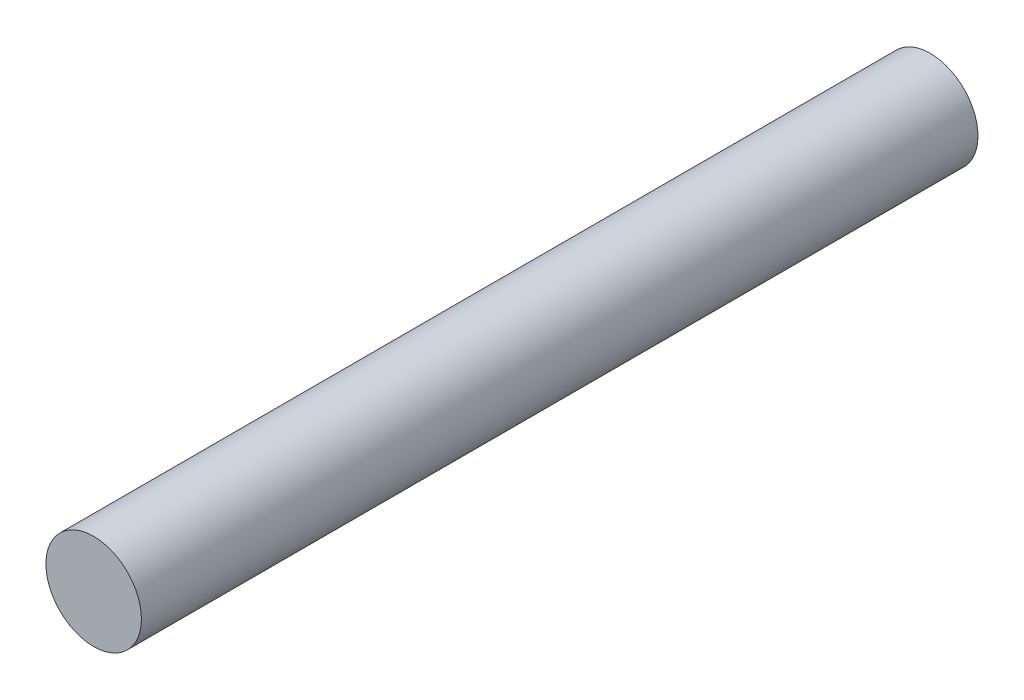
ISO-10303-21;
HEADER;
FILE_DESCRIPTION(('STEP AP214'),'2;1');
FILE_NAME('part.step','',(''),(''),'','','');
FILE_SCHEMA(('AUTOMOTIVE_DESIGN { 1 0 10303 214 1 1 1 1 }'));
ENDSEC;
DATA;
#1=APPLICATION_CONTEXT('core data for automotive mechanical design processes');
#2=APPLICATION_PROTOCOL_DEFINITION('international standard','automotive_design',2000,#1);
#3=PRODUCT_CONTEXT('',#1,'mechanical');
#4=PRODUCT('Part','Part','',(#3));
#5=PRODUCT_RELATED_PRODUCT_CATEGORY('part','',(#4));
#6=PRODUCT_DEFINITION_FORMATION('','',#4);
#7=PRODUCT_DEFINITION_CONTEXT('part definition',#1,'design');
#8=PRODUCT_DEFINITION('design','',#6,#7);
#9=PRODUCT_DEFINITION_SHAPE('','',#8);
#10=(LENGTH_UNIT() NAMED_UNIT(*) SI_UNIT(.MILLI.,.METRE.));
#11=(NAMED_UNIT(*) PLANE_ANGLE_UNIT() SI_UNIT($,.RADIAN.));
#12=(NAMED_UNIT(*) SI_UNIT($,.STERADIAN.) SOLID_ANGLE_UNIT());
#13=UNCERTAINTY_MEASURE_WITH_UNIT(LENGTH_MEASURE(1.E-05),#10,'distance_accuracy_value','');
#14=(GEOMETRIC_REPRESENTATION_CONTEXT(3) GLOBAL_UNCERTAINTY_ASSIGNED_CONTEXT((#13)) GLOBAL_UNIT_ASSIGNED_CONTEXT((#10,
#11,#12)) REPRESENTATION_CONTEXT('',''));
#15=CARTESIAN_POINT('',(0.,0.,0.));
#16=DIRECTION('',(0.,0.,1.));
#17=DIRECTION('',(1.,0.,0.));
#18=AXIS2_PLACEMENT_3D('',#15,#16,#17);
#19=CARTESIAN_POINT('',(0.,0.,-43.8));
#20=DIRECTION('',(0.,0.,1.));
#21=DIRECTION('',(-1.,0.,0.));
#22=AXIS2_PLACEMENT_3D('',#19,#20,#21);
#23=CYLINDRICAL_SURFACE('',#22,2.5);
#24=CARTESIAN_POINT('',(0.,0.,-43.8));
#25=DIRECTION('',(0.,0.,1.));
#26=DIRECTION('',(1.,0.,0.));
#27=AXIS2_PLACEMENT_3D('',#24,#25,#26);
#28=CIRCLE('',#27,2.5);
#29=CARTESIAN_POINT('',(2.5,0.,-43.8));
#30=VERTEX_POINT('',#29);
#31=EDGE_CURVE('E10',#30,#30,#28,.T.);
#32=ORIENTED_EDGE('',*,*,#31,.T.);
#33=EDGE_LOOP('',(#32));
#34=FACE_BOUND('',#33,.T.);
#35=CARTESIAN_POINT('',(0.,0.,0.));
#36=DIRECTION('',(0.,0.,1.));
#37=DIRECTION('',(1.,0.,0.));
#38=AXIS2_PLACEMENT_3D('',#35,#36,#37);
#39=CIRCLE('',#38,2.5);
#40=CARTESIAN_POINT('',(2.5,0.,0.));
#41=VERTEX_POINT('',#40);
#42=EDGE_CURVE('E40',#41,#41,#39,.T.);
#43=ORIENTED_EDGE('',*,*,#42,.F.);
#44=EDGE_LOOP('',(#43));
#45=FACE_BOUND('',#44,.T.);
#46=ADVANCED_FACE('F37',(#34,#45),#23,.T.);
#47=CARTESIAN_POINT('',(0.,0.,-43.8));
#48=DIRECTION('',(0.,0.,-1.));
#49=DIRECTION('',(1.,0.,0.));
#50=AXIS2_PLACEMENT_3D('',#47,#48,#49);
#51=PLANE('',#50);
#52=ORIENTED_EDGE('',*,*,#31,.F.);
#53=EDGE_LOOP('',(#52));
#54=FACE_BOUND('',#53,.T.);
#55=ADVANCED_FACE('F52',(#54),#51,.T.);
#56=CARTESIAN_POINT('',(0.,0.,0.));
#57=DIRECTION('',(0.,0.,-1.));
#58=DIRECTION('',(1.,0.,0.));
#59=AXIS2_PLACEMENT_3D('',#56,#57,#58);
#60=PLANE('',#59);
#61=ORIENTED_EDGE('',*,*,#42,.T.);
#62=EDGE_LOOP('',(#61));
#63=FACE_BOUND('',#62,.T.);
#64=ADVANCED_FACE('F49',(#63),#60,.F.);
#65=CLOSED_SHELL('',(#46,#55,#64));
#66=MANIFOLD_SOLID_BREP('B2',#65);
#67=ADVANCED_BREP_SHAPE_REPRESENTATION('',(#18,#66),#14);
#68=SHAPE_DEFINITION_REPRESENTATION(#9,#67);
ENDSEC;
END-ISO-10303-21;
